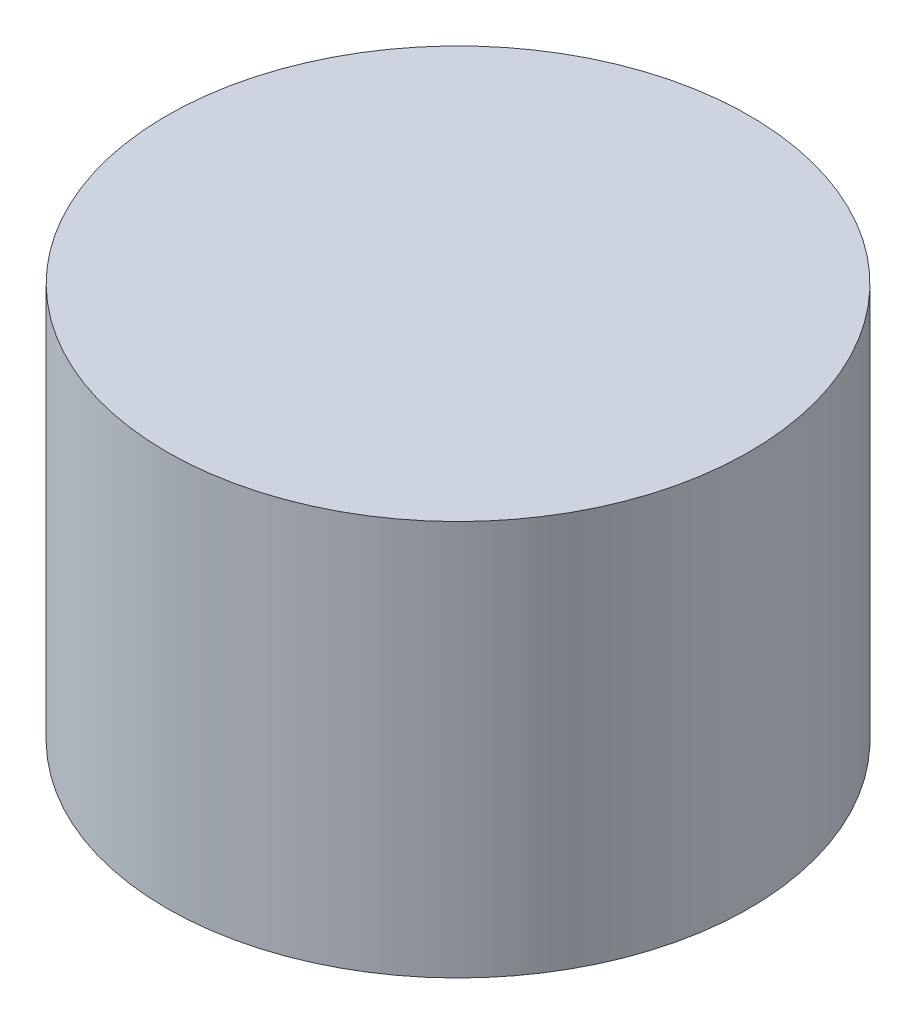
ISO-10303-21;
HEADER;
FILE_DESCRIPTION(('STEP AP214'),'2;1');
FILE_NAME('part.step','',(''),(''),'','','');
FILE_SCHEMA(('AUTOMOTIVE_DESIGN { 1 0 10303 214 1 1 1 1 }'));
ENDSEC;
DATA;
#1=APPLICATION_CONTEXT('core data for automotive mechanical design processes');
#2=APPLICATION_PROTOCOL_DEFINITION('international standard','automotive_design',2000,#1);
#3=PRODUCT_CONTEXT('',#1,'mechanical');
#4=PRODUCT('Part','Part','',(#3));
#5=PRODUCT_RELATED_PRODUCT_CATEGORY('part','',(#4));
#6=PRODUCT_DEFINITION_FORMATION('','',#4);
#7=PRODUCT_DEFINITION_CONTEXT('part definition',#1,'design');
#8=PRODUCT_DEFINITION('design','',#6,#7);
#9=PRODUCT_DEFINITION_SHAPE('','',#8);
#10=(LENGTH_UNIT() NAMED_UNIT(*) SI_UNIT(.MILLI.,.METRE.));
#11=(NAMED_UNIT(*) PLANE_ANGLE_UNIT() SI_UNIT($,.RADIAN.));
#12=(NAMED_UNIT(*) SI_UNIT($,.STERADIAN.) SOLID_ANGLE_UNIT());
#13=UNCERTAINTY_MEASURE_WITH_UNIT(LENGTH_MEASURE(1.E-05),#10,'distance_accuracy_value','');
#14=(GEOMETRIC_REPRESENTATION_CONTEXT(3) GLOBAL_UNCERTAINTY_ASSIGNED_CONTEXT((#13)) GLOBAL_UNIT_ASSIGNED_CONTEXT((#10,
#11,#12)) REPRESENTATION_CONTEXT('',''));
#15=CARTESIAN_POINT('',(0.,0.,0.));
#16=DIRECTION('',(0.,0.,1.));
#17=DIRECTION('',(1.,0.,0.));
#18=AXIS2_PLACEMENT_3D('',#15,#16,#17);
#19=CARTESIAN_POINT('',(0.,19.,0.));
#20=DIRECTION('',(0.,-1.,0.));
#21=DIRECTION('',(0.,0.,-1.));
#22=AXIS2_PLACEMENT_3D('',#19,#20,#21);
#23=CYLINDRICAL_SURFACE('',#22,14.);
#24=CARTESIAN_POINT('',(0.,19.,0.));
#25=DIRECTION('',(0.,1.,0.));
#26=DIRECTION('',(0.,0.,1.));
#27=AXIS2_PLACEMENT_3D('',#24,#25,#26);
#28=CIRCLE('',#27,14.);
#29=CARTESIAN_POINT('',(0.,19.,14.));
#30=VERTEX_POINT('',#29);
#31=EDGE_CURVE('E10',#30,#30,#28,.T.);
#32=ORIENTED_EDGE('',*,*,#31,.F.);
#33=EDGE_LOOP('',(#32));
#34=FACE_BOUND('',#33,.T.);
#35=CARTESIAN_POINT('',(0.,0.,0.));
#36=DIRECTION('',(0.,1.,0.));
#37=DIRECTION('',(0.,0.,1.));
#38=AXIS2_PLACEMENT_3D('',#35,#36,#37);
#39=CIRCLE('',#38,14.);
#40=CARTESIAN_POINT('',(0.,0.,14.));
#41=VERTEX_POINT('',#40);
#42=EDGE_CURVE('E36',#41,#41,#39,.T.);
#43=ORIENTED_EDGE('',*,*,#42,.T.);
#44=EDGE_LOOP('',(#43));
#45=FACE_BOUND('',#44,.T.);
#46=ADVANCED_FACE('F33',(#34,#45),#23,.T.);
#47=CARTESIAN_POINT('',(0.,19.,0.));
#48=DIRECTION('',(0.,1.,0.));
#49=DIRECTION('',(0.,0.,1.));
#50=AXIS2_PLACEMENT_3D('',#47,#48,#49);
#51=PLANE('',#50);
#52=ORIENTED_EDGE('',*,*,#31,.T.);
#53=EDGE_LOOP('',(#52));
#54=FACE_BOUND('',#53,.T.);
#55=ADVANCED_FACE('F48',(#54),#51,.T.);
#56=CARTESIAN_POINT('',(0.,0.,0.));
#57=DIRECTION('',(0.,1.,0.));
#58=DIRECTION('',(0.,0.,1.));
#59=AXIS2_PLACEMENT_3D('',#56,#57,#58);
#60=PLANE('',#59);
#61=ORIENTED_EDGE('',*,*,#42,.F.);
#62=EDGE_LOOP('',(#61));
#63=FACE_BOUND('',#62,.T.);
#64=ADVANCED_FACE('F46',(#63),#60,.F.);
#65=CLOSED_SHELL('',(#46,#55,#64));
#66=MANIFOLD_SOLID_BREP('B2',#65);
#67=ADVANCED_BREP_SHAPE_REPRESENTATION('',(#18,#66),#14);
#68=SHAPE_DEFINITION_REPRESENTATION(#9,#67);
ENDSEC;
END-ISO-10303-21;
